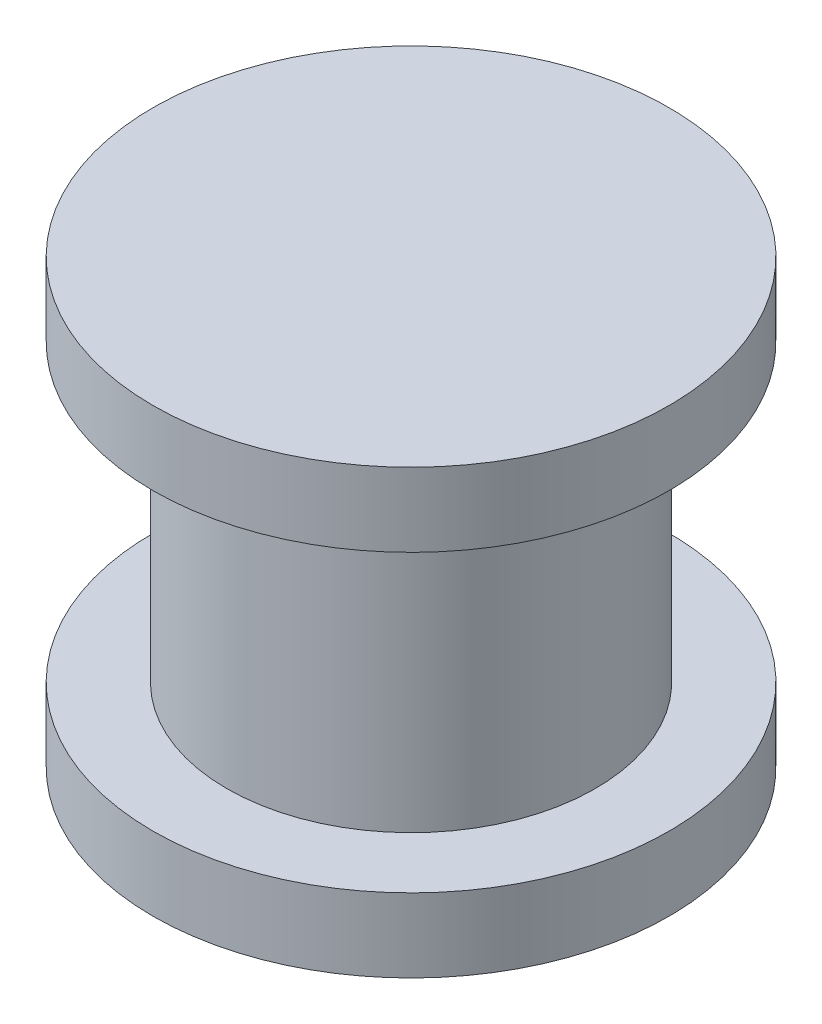
ISO-10303-21;
HEADER;
FILE_DESCRIPTION(('STEP AP214'),'2;1');
FILE_NAME('part.step','',(''),(''),'','','');
FILE_SCHEMA(('AUTOMOTIVE_DESIGN { 1 0 10303 214 1 1 1 1 }'));
ENDSEC;
DATA;
#1=APPLICATION_CONTEXT('core data for automotive mechanical design processes');
#2=APPLICATION_PROTOCOL_DEFINITION('international standard','automotive_design',2000,#1);
#3=PRODUCT_CONTEXT('',#1,'mechanical');
#4=PRODUCT('Part','Part','',(#3));
#5=PRODUCT_RELATED_PRODUCT_CATEGORY('part','',(#4));
#6=PRODUCT_DEFINITION_FORMATION('','',#4);
#7=PRODUCT_DEFINITION_CONTEXT('part definition',#1,'design');
#8=PRODUCT_DEFINITION('design','',#6,#7);
#9=PRODUCT_DEFINITION_SHAPE('','',#8);
#10=(LENGTH_UNIT() NAMED_UNIT(*) SI_UNIT(.MILLI.,.METRE.));
#11=(NAMED_UNIT(*) PLANE_ANGLE_UNIT() SI_UNIT($,.RADIAN.));
#12=(NAMED_UNIT(*) SI_UNIT($,.STERADIAN.) SOLID_ANGLE_UNIT());
#13=UNCERTAINTY_MEASURE_WITH_UNIT(LENGTH_MEASURE(1.E-05),#10,'distance_accuracy_value','');
#14=(GEOMETRIC_REPRESENTATION_CONTEXT(3) GLOBAL_UNCERTAINTY_ASSIGNED_CONTEXT((#13)) GLOBAL_UNIT_ASSIGNED_CONTEXT((#10,
#11,#12)) REPRESENTATION_CONTEXT('',''));
#15=CARTESIAN_POINT('',(0.,0.,0.));
#16=DIRECTION('',(0.,0.,1.));
#17=DIRECTION('',(1.,0.,0.));
#18=AXIS2_PLACEMENT_3D('',#15,#16,#17);
#19=CARTESIAN_POINT('',(0.,3.81,0.));
#20=DIRECTION('',(0.,1.,0.));
#21=DIRECTION('',(0.,0.,1.));
#22=AXIS2_PLACEMENT_3D('',#19,#20,#21);
#23=PLANE('',#22);
#24=CARTESIAN_POINT('',(0.,3.81,0.));
#25=DIRECTION('',(0.,1.,0.));
#26=DIRECTION('',(0.,0.,1.));
#27=AXIS2_PLACEMENT_3D('',#24,#25,#26);
#28=CIRCLE('',#27,4.44499999999999);
#29=CARTESIAN_POINT('',(0.,3.81,4.44499999999999));
#30=VERTEX_POINT('',#29);
#31=EDGE_CURVE('E70',#30,#30,#28,.T.);
#32=ORIENTED_EDGE('',*,*,#31,.T.);
#33=EDGE_LOOP('',(#32));
#34=FACE_BOUND('',#33,.T.);
#35=ADVANCED_FACE('F43',(#34),#23,.T.);
#36=CARTESIAN_POINT('',(0.,-3.81,0.));
#37=DIRECTION('',(0.,1.,0.));
#38=DIRECTION('',(0.,0.,1.));
#39=AXIS2_PLACEMENT_3D('',#36,#37,#38);
#40=PLANE('',#39);
#41=CARTESIAN_POINT('',(0.,-3.81,0.));
#42=DIRECTION('',(0.,1.,0.));
#43=DIRECTION('',(0.,0.,1.));
#44=AXIS2_PLACEMENT_3D('',#41,#42,#43);
#45=CIRCLE('',#44,4.445);
#46=CARTESIAN_POINT('',(0.,-3.81,4.445));
#47=VERTEX_POINT('',#46);
#48=EDGE_CURVE('E10',#47,#47,#45,.T.);
#49=ORIENTED_EDGE('',*,*,#48,.F.);
#50=EDGE_LOOP('',(#49));
#51=FACE_BOUND('',#50,.T.);
#52=ADVANCED_FACE('F88',(#51),#40,.F.);
#53=CARTESIAN_POINT('',(0.,55.,0.));
#54=DIRECTION('',(0.,1.,0.));
#55=DIRECTION('',(0.,0.,1.));
#56=AXIS2_PLACEMENT_3D('',#53,#54,#55);
#57=CYLINDRICAL_SURFACE('',#56,4.445);
#58=ORIENTED_EDGE('',*,*,#48,.T.);
#59=EDGE_LOOP('',(#58));
#60=FACE_BOUND('',#59,.T.);
#61=CARTESIAN_POINT('',(0.,-2.54,0.));
#62=DIRECTION('',(0.,1.,0.));
#63=DIRECTION('',(0.,0.,1.));
#64=AXIS2_PLACEMENT_3D('',#61,#62,#63);
#65=CIRCLE('',#64,4.445);
#66=CARTESIAN_POINT('',(0.,-2.54,4.445));
#67=VERTEX_POINT('',#66);
#68=EDGE_CURVE('E50',#67,#67,#65,.T.);
#69=ORIENTED_EDGE('',*,*,#68,.F.);
#70=EDGE_LOOP('',(#69));
#71=FACE_BOUND('',#70,.T.);
#72=ADVANCED_FACE('F92',(#60,#71),#57,.T.);
#73=CARTESIAN_POINT('',(0.,-2.54,0.));
#74=DIRECTION('',(0.,1.,0.));
#75=DIRECTION('',(0.,0.,1.));
#76=AXIS2_PLACEMENT_3D('',#73,#74,#75);
#77=PLANE('',#76);
#78=ORIENTED_EDGE('',*,*,#68,.T.);
#79=EDGE_LOOP('',(#78));
#80=FACE_BOUND('',#79,.T.);
#81=CARTESIAN_POINT('',(0.,-2.54,0.));
#82=DIRECTION('',(0.,1.,0.));
#83=DIRECTION('',(0.,0.,1.));
#84=AXIS2_PLACEMENT_3D('',#81,#82,#83);
#85=CIRCLE('',#84,3.17500000000001);
#86=CARTESIAN_POINT('',(0.,-2.54,3.17500000000001));
#87=VERTEX_POINT('',#86);
#88=EDGE_CURVE('E55',#87,#87,#85,.T.);
#89=ORIENTED_EDGE('',*,*,#88,.F.);
#90=EDGE_LOOP('',(#89));
#91=FACE_BOUND('',#90,.T.);
#92=ADVANCED_FACE('F97',(#80,#91),#77,.T.);
#93=CARTESIAN_POINT('',(0.,55.,0.));
#94=DIRECTION('',(0.,1.,0.));
#95=DIRECTION('',(0.,0.,1.));
#96=AXIS2_PLACEMENT_3D('',#93,#94,#95);
#97=CYLINDRICAL_SURFACE('',#96,3.17500000000001);
#98=ORIENTED_EDGE('',*,*,#88,.T.);
#99=EDGE_LOOP('',(#98));
#100=FACE_BOUND('',#99,.T.);
#101=CARTESIAN_POINT('',(0.,2.54,0.));
#102=DIRECTION('',(0.,1.,0.));
#103=DIRECTION('',(0.,0.,1.));
#104=AXIS2_PLACEMENT_3D('',#101,#102,#103);
#105=CIRCLE('',#104,3.17500000000001);
#106=CARTESIAN_POINT('',(0.,2.54,3.17500000000001));
#107=VERTEX_POINT('',#106);
#108=EDGE_CURVE('E60',#107,#107,#105,.T.);
#109=ORIENTED_EDGE('',*,*,#108,.F.);
#110=EDGE_LOOP('',(#109));
#111=FACE_BOUND('',#110,.T.);
#112=ADVANCED_FACE('F84',(#100,#111),#97,.T.);
#113=CARTESIAN_POINT('',(0.,2.54,0.));
#114=DIRECTION('',(0.,-1.,0.));
#115=DIRECTION('',(0.,0.,-1.));
#116=AXIS2_PLACEMENT_3D('',#113,#114,#115);
#117=PLANE('',#116);
#118=ORIENTED_EDGE('',*,*,#108,.T.);
#119=EDGE_LOOP('',(#118));
#120=FACE_BOUND('',#119,.T.);
#121=CARTESIAN_POINT('',(0.,2.54,0.));
#122=DIRECTION('',(0.,1.,0.));
#123=DIRECTION('',(0.,0.,1.));
#124=AXIS2_PLACEMENT_3D('',#121,#122,#123);
#125=CIRCLE('',#124,4.44500000000001);
#126=CARTESIAN_POINT('',(0.,2.54,4.44500000000001));
#127=VERTEX_POINT('',#126);
#128=EDGE_CURVE('E66',#127,#127,#125,.T.);
#129=ORIENTED_EDGE('',*,*,#128,.F.);
#130=EDGE_LOOP('',(#129));
#131=FACE_BOUND('',#130,.T.);
#132=ADVANCED_FACE('F78',(#120,#131),#117,.T.);
#133=CARTESIAN_POINT('',(0.,55.,0.));
#134=DIRECTION('',(0.,1.,0.));
#135=DIRECTION('',(0.,0.,1.));
#136=AXIS2_PLACEMENT_3D('',#133,#134,#135);
#137=CYLINDRICAL_SURFACE('',#136,4.445);
#138=ORIENTED_EDGE('',*,*,#128,.T.);
#139=EDGE_LOOP('',(#138));
#140=FACE_BOUND('',#139,.T.);
#141=ORIENTED_EDGE('',*,*,#31,.F.);
#142=EDGE_LOOP('',(#141));
#143=FACE_BOUND('',#142,.T.);
#144=ADVANCED_FACE('F76',(#140,#143),#137,.T.);
#145=CLOSED_SHELL('',(#35,#52,#72,#92,#112,#132,#144));
#146=MANIFOLD_SOLID_BREP('B2',#145);
#147=ADVANCED_BREP_SHAPE_REPRESENTATION('',(#18,#146),#14);
#148=SHAPE_DEFINITION_REPRESENTATION(#9,#147);
ENDSEC;
END-ISO-10303-21;
